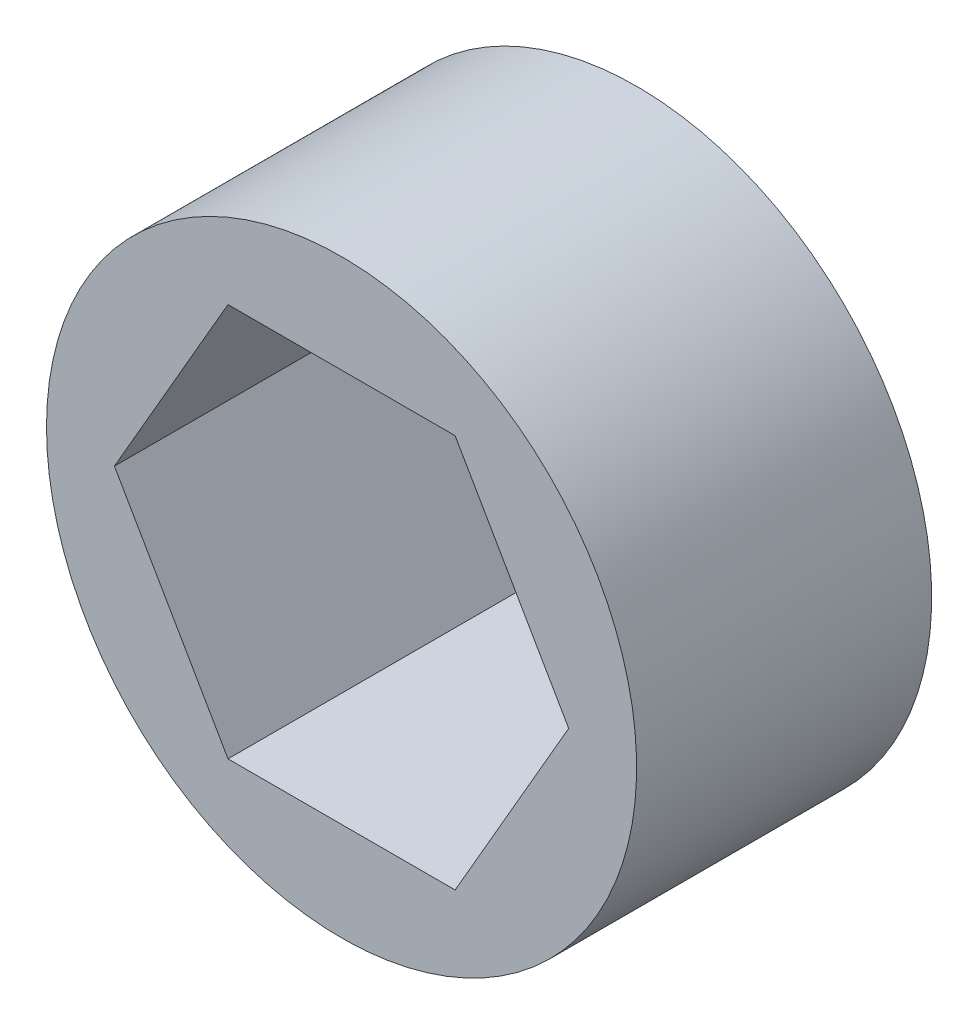
ISO-10303-21;
HEADER;
FILE_DESCRIPTION(('STEP AP214'),'2;1');
FILE_NAME('part.step','',(''),(''),'','','');
FILE_SCHEMA(('AUTOMOTIVE_DESIGN { 1 0 10303 214 1 1 1 1 }'));
ENDSEC;
DATA;
#1=APPLICATION_CONTEXT('core data for automotive mechanical design processes');
#2=APPLICATION_PROTOCOL_DEFINITION('international standard','automotive_design',2000,#1);
#3=PRODUCT_CONTEXT('',#1,'mechanical');
#4=PRODUCT('Part','Part','',(#3));
#5=PRODUCT_RELATED_PRODUCT_CATEGORY('part','',(#4));
#6=PRODUCT_DEFINITION_FORMATION('','',#4);
#7=PRODUCT_DEFINITION_CONTEXT('part definition',#1,'design');
#8=PRODUCT_DEFINITION('design','',#6,#7);
#9=PRODUCT_DEFINITION_SHAPE('','',#8);
#10=(LENGTH_UNIT() NAMED_UNIT(*) SI_UNIT(.MILLI.,.METRE.));
#11=(NAMED_UNIT(*) PLANE_ANGLE_UNIT() SI_UNIT($,.RADIAN.));
#12=(NAMED_UNIT(*) SI_UNIT($,.STERADIAN.) SOLID_ANGLE_UNIT());
#13=UNCERTAINTY_MEASURE_WITH_UNIT(LENGTH_MEASURE(1.E-05),#10,'distance_accuracy_value','');
#14=(GEOMETRIC_REPRESENTATION_CONTEXT(3) GLOBAL_UNCERTAINTY_ASSIGNED_CONTEXT((#13)) GLOBAL_UNIT_ASSIGNED_CONTEXT((#10,
#11,#12)) REPRESENTATION_CONTEXT('',''));
#15=CARTESIAN_POINT('',(0.,0.,0.));
#16=DIRECTION('',(0.,0.,1.));
#17=DIRECTION('',(1.,0.,0.));
#18=AXIS2_PLACEMENT_3D('',#15,#16,#17);
#19=CARTESIAN_POINT('',(0.,0.,9.525));
#20=DIRECTION('',(0.,0.,1.));
#21=DIRECTION('',(1.,0.,0.));
#22=AXIS2_PLACEMENT_3D('',#19,#20,#21);
#23=PLANE('',#22);
#24=CARTESIAN_POINT('',(0.,0.,9.525));
#25=DIRECTION('',(0.,0.,1.));
#26=DIRECTION('',(1.,0.,0.));
#27=AXIS2_PLACEMENT_3D('',#24,#25,#26);
#28=CIRCLE('',#27,9.525);
#29=CARTESIAN_POINT('',(-9.525,0.,9.525));
#30=VERTEX_POINT('',#29);
#31=EDGE_CURVE('E12',#30,#30,#28,.T.);
#32=ORIENTED_EDGE('',*,*,#31,.T.);
#33=EDGE_LOOP('',(#32));
#34=FACE_BOUND('',#33,.T.);
#35=DIRECTION('',(0.5,0.866025403784439,0.));
#36=VECTOR('',#35,1.);
#37=CARTESIAN_POINT('',(5.49926131403119,-3.175,9.525));
#38=LINE('',#37,#36);
#39=CARTESIAN_POINT('',(3.66617420935413,-6.35,9.525));
#40=VERTEX_POINT('',#39);
#41=CARTESIAN_POINT('',(7.33234841870825,0.,9.525));
#42=VERTEX_POINT('',#41);
#43=EDGE_CURVE('E133',#40,#42,#38,.T.);
#44=ORIENTED_EDGE('',*,*,#43,.F.);
#45=DIRECTION('',(1.,0.,0.));
#46=VECTOR('',#45,1.);
#47=CARTESIAN_POINT('',(0.,-6.35,9.525));
#48=LINE('',#47,#46);
#49=CARTESIAN_POINT('',(-3.66617420935412,-6.35,9.525));
#50=VERTEX_POINT('',#49);
#51=EDGE_CURVE('E124',#50,#40,#48,.T.);
#52=ORIENTED_EDGE('',*,*,#51,.F.);
#53=DIRECTION('',(0.5,-0.866025403784439,0.));
#54=VECTOR('',#53,1.);
#55=CARTESIAN_POINT('',(-5.49926131403118,-3.175,9.525));
#56=LINE('',#55,#54);
#57=CARTESIAN_POINT('',(-7.33234841870825,0.,9.525));
#58=VERTEX_POINT('',#57);
#59=EDGE_CURVE('E158',#58,#50,#56,.T.);
#60=ORIENTED_EDGE('',*,*,#59,.F.);
#61=DIRECTION('',(-0.5,-0.866025403784439,0.));
#62=VECTOR('',#61,1.);
#63=CARTESIAN_POINT('',(-5.49926131403118,3.175,9.525));
#64=LINE('',#63,#62);
#65=CARTESIAN_POINT('',(-3.66617420935412,6.35,9.525));
#66=VERTEX_POINT('',#65);
#67=EDGE_CURVE('E155',#66,#58,#64,.T.);
#68=ORIENTED_EDGE('',*,*,#67,.F.);
#69=DIRECTION('',(-1.,0.,0.));
#70=VECTOR('',#69,1.);
#71=CARTESIAN_POINT('',(0.,6.35,9.525));
#72=LINE('',#71,#70);
#73=CARTESIAN_POINT('',(3.66617420935412,6.35,9.525));
#74=VERTEX_POINT('',#73);
#75=EDGE_CURVE('E150',#74,#66,#72,.T.);
#76=ORIENTED_EDGE('',*,*,#75,.F.);
#77=DIRECTION('',(-0.5,0.866025403784439,0.));
#78=VECTOR('',#77,1.);
#79=CARTESIAN_POINT('',(5.49926131403118,3.175,9.525));
#80=LINE('',#79,#78);
#81=EDGE_CURVE('E146',#42,#74,#80,.T.);
#82=ORIENTED_EDGE('',*,*,#81,.F.);
#83=EDGE_LOOP('',(#44,#52,#60,#68,#76,#82));
#84=FACE_BOUND('',#83,.T.);
#85=ADVANCED_FACE('F70',(#34,#84),#23,.T.);
#86=CARTESIAN_POINT('',(0.,0.,0.));
#87=DIRECTION('',(0.,0.,1.));
#88=DIRECTION('',(1.,0.,0.));
#89=AXIS2_PLACEMENT_3D('',#86,#87,#88);
#90=PLANE('',#89);
#91=CARTESIAN_POINT('',(0.,0.,0.));
#92=DIRECTION('',(0.,0.,1.));
#93=DIRECTION('',(1.,0.,0.));
#94=AXIS2_PLACEMENT_3D('',#91,#92,#93);
#95=CIRCLE('',#94,9.525);
#96=CARTESIAN_POINT('',(-9.525,0.,0.));
#97=VERTEX_POINT('',#96);
#98=EDGE_CURVE('E74',#97,#97,#95,.T.);
#99=ORIENTED_EDGE('',*,*,#98,.F.);
#100=EDGE_LOOP('',(#99));
#101=FACE_BOUND('',#100,.T.);
#102=DIRECTION('',(1.,0.,0.));
#103=VECTOR('',#102,1.);
#104=CARTESIAN_POINT('',(0.,-6.35,0.));
#105=LINE('',#104,#103);
#106=CARTESIAN_POINT('',(-3.66617420935412,-6.35,0.));
#107=VERTEX_POINT('',#106);
#108=CARTESIAN_POINT('',(3.66617420935413,-6.35,0.));
#109=VERTEX_POINT('',#108);
#110=EDGE_CURVE('E94',#107,#109,#105,.T.);
#111=ORIENTED_EDGE('',*,*,#110,.T.);
#112=DIRECTION('',(0.5,0.866025403784439,0.));
#113=VECTOR('',#112,1.);
#114=CARTESIAN_POINT('',(5.49926131403119,-3.175,0.));
#115=LINE('',#114,#113);
#116=CARTESIAN_POINT('',(7.33234841870825,0.,0.));
#117=VERTEX_POINT('',#116);
#118=EDGE_CURVE('E140',#109,#117,#115,.T.);
#119=ORIENTED_EDGE('',*,*,#118,.T.);
#120=DIRECTION('',(-0.5,0.866025403784439,0.));
#121=VECTOR('',#120,1.);
#122=CARTESIAN_POINT('',(5.49926131403118,3.175,0.));
#123=LINE('',#122,#121);
#124=CARTESIAN_POINT('',(3.66617420935412,6.35,0.));
#125=VERTEX_POINT('',#124);
#126=EDGE_CURVE('E165',#117,#125,#123,.T.);
#127=ORIENTED_EDGE('',*,*,#126,.T.);
#128=DIRECTION('',(-1.,0.,0.));
#129=VECTOR('',#128,1.);
#130=CARTESIAN_POINT('',(0.,6.35,0.));
#131=LINE('',#130,#129);
#132=CARTESIAN_POINT('',(-3.66617420935412,6.35,0.));
#133=VERTEX_POINT('',#132);
#134=EDGE_CURVE('E169',#125,#133,#131,.T.);
#135=ORIENTED_EDGE('',*,*,#134,.T.);
#136=DIRECTION('',(-0.5,-0.866025403784439,0.));
#137=VECTOR('',#136,1.);
#138=CARTESIAN_POINT('',(-5.49926131403118,3.175,0.));
#139=LINE('',#138,#137);
#140=CARTESIAN_POINT('',(-7.33234841870825,0.,0.));
#141=VERTEX_POINT('',#140);
#142=EDGE_CURVE('E173',#133,#141,#139,.T.);
#143=ORIENTED_EDGE('',*,*,#142,.T.);
#144=DIRECTION('',(0.5,-0.866025403784439,0.));
#145=VECTOR('',#144,1.);
#146=CARTESIAN_POINT('',(-5.49926131403118,-3.175,0.));
#147=LINE('',#146,#145);
#148=EDGE_CURVE('E134',#141,#107,#147,.T.);
#149=ORIENTED_EDGE('',*,*,#148,.T.);
#150=EDGE_LOOP('',(#111,#119,#127,#135,#143,#149));
#151=FACE_BOUND('',#150,.T.);
#152=ADVANCED_FACE('F197',(#101,#151),#90,.F.);
#153=CARTESIAN_POINT('',(0.,0.,9.525));
#154=DIRECTION('',(0.,0.,-1.));
#155=DIRECTION('',(-1.,0.,0.));
#156=AXIS2_PLACEMENT_3D('',#153,#154,#155);
#157=CYLINDRICAL_SURFACE('',#156,9.525);
#158=CARTESIAN_POINT('',(-9.525,0.,9.525));
#159=CARTESIAN_POINT('',(-9.525,0.,9.42578125));
#160=CARTESIAN_POINT('',(-9.525,0.,9.3265625));
#161=CARTESIAN_POINT('',(-9.525,0.,9.128125));
#162=CARTESIAN_POINT('',(-9.525,0.,9.02890625));
#163=CARTESIAN_POINT('',(-9.525,0.,8.83046875));
#164=CARTESIAN_POINT('',(-9.525,0.,8.73125));
#165=CARTESIAN_POINT('',(-9.525,0.,8.5328125));
#166=CARTESIAN_POINT('',(-9.525,0.,8.43359375));
#167=CARTESIAN_POINT('',(-9.525,0.,8.23515625));
#168=CARTESIAN_POINT('',(-9.525,0.,8.1359375));
#169=CARTESIAN_POINT('',(-9.525,0.,7.9375));
#170=CARTESIAN_POINT('',(-9.525,0.,7.83828125));
#171=CARTESIAN_POINT('',(-9.525,0.,7.63984375));
#172=CARTESIAN_POINT('',(-9.525,0.,7.540625));
#173=CARTESIAN_POINT('',(-9.525,0.,7.3421875));
#174=CARTESIAN_POINT('',(-9.525,0.,7.24296875));
#175=CARTESIAN_POINT('',(-9.525,0.,7.04453125));
#176=CARTESIAN_POINT('',(-9.525,0.,6.9453125));
#177=CARTESIAN_POINT('',(-9.525,0.,6.746875));
#178=CARTESIAN_POINT('',(-9.525,0.,6.64765625));
#179=CARTESIAN_POINT('',(-9.525,0.,6.44921875));
#180=CARTESIAN_POINT('',(-9.525,0.,6.35));
#181=CARTESIAN_POINT('',(-9.525,0.,6.1515625));
#182=CARTESIAN_POINT('',(-9.525,0.,6.05234375));
#183=CARTESIAN_POINT('',(-9.525,0.,5.85390625));
#184=CARTESIAN_POINT('',(-9.525,0.,5.7546875));
#185=CARTESIAN_POINT('',(-9.525,0.,5.55625));
#186=CARTESIAN_POINT('',(-9.525,0.,5.45703125));
#187=CARTESIAN_POINT('',(-9.525,0.,5.25859375));
#188=CARTESIAN_POINT('',(-9.525,0.,5.159375));
#189=CARTESIAN_POINT('',(-9.525,0.,4.9609375));
#190=CARTESIAN_POINT('',(-9.525,0.,4.86171875));
#191=CARTESIAN_POINT('',(-9.525,0.,4.66328125));
#192=CARTESIAN_POINT('',(-9.525,0.,4.5640625));
#193=CARTESIAN_POINT('',(-9.525,0.,4.365625));
#194=CARTESIAN_POINT('',(-9.525,0.,4.26640625));
#195=CARTESIAN_POINT('',(-9.525,0.,4.06796875));
#196=CARTESIAN_POINT('',(-9.525,0.,3.96875));
#197=CARTESIAN_POINT('',(-9.525,0.,3.7703125));
#198=CARTESIAN_POINT('',(-9.525,0.,3.67109375));
#199=CARTESIAN_POINT('',(-9.525,0.,3.47265625));
#200=CARTESIAN_POINT('',(-9.525,0.,3.3734375));
#201=CARTESIAN_POINT('',(-9.525,0.,3.175));
#202=CARTESIAN_POINT('',(-9.525,0.,3.07578125));
#203=CARTESIAN_POINT('',(-9.525,0.,2.87734375));
#204=CARTESIAN_POINT('',(-9.525,0.,2.778125));
#205=CARTESIAN_POINT('',(-9.525,0.,2.5796875));
#206=CARTESIAN_POINT('',(-9.525,0.,2.48046875));
#207=CARTESIAN_POINT('',(-9.525,0.,2.28203125));
#208=CARTESIAN_POINT('',(-9.525,0.,2.1828125));
#209=CARTESIAN_POINT('',(-9.525,0.,1.984375));
#210=CARTESIAN_POINT('',(-9.525,0.,1.88515625));
#211=CARTESIAN_POINT('',(-9.525,0.,1.68671875));
#212=CARTESIAN_POINT('',(-9.525,0.,1.5875));
#213=CARTESIAN_POINT('',(-9.525,0.,1.3890625));
#214=CARTESIAN_POINT('',(-9.525,0.,1.28984375));
#215=CARTESIAN_POINT('',(-9.525,0.,1.09140625));
#216=CARTESIAN_POINT('',(-9.525,0.,0.992187500000001));
#217=CARTESIAN_POINT('',(-9.525,0.,0.793750000000001));
#218=CARTESIAN_POINT('',(-9.525,0.,0.69453125));
#219=CARTESIAN_POINT('',(-9.525,0.,0.49609375));
#220=CARTESIAN_POINT('',(-9.525,0.,0.396875));
#221=CARTESIAN_POINT('',(-9.525,0.,0.1984375));
#222=CARTESIAN_POINT('',(-9.525,0.,0.0992187500000001));
#223=CARTESIAN_POINT('',(-9.525,0.,0.));
#224=B_SPLINE_CURVE_WITH_KNOTS('',3,(#158,#159,#160,#161,#162,#163,#164,#165,#166,#167,#168,
#169,#170,#171,#172,#173,#174,#175,#176,#177,#178,#179,#180,#181,#182,#183,#184,#185,#186,#187,
#188,#189,#190,#191,#192,#193,#194,#195,#196,#197,#198,#199,#200,#201,#202,#203,#204,#205,#206,
#207,#208,#209,#210,#211,#212,#213,#214,#215,#216,#217,#218,#219,#220,#221,#222,#223),
.UNSPECIFIED.,.F.,.F.,(4,2,2,2,2,2,2,2,2,2,2,2,2,2,2,2,2,2,2,2,2,2,2,2,2,2,2,2,2,2,2,2,4),(0.,
0.29765625,0.5953125,0.892968750000001,1.190625,1.48828125,1.7859375,2.08359375,2.38125,
2.67890625,2.9765625,3.27421875,3.571875,3.86953125,4.1671875,4.46484375,4.7625,5.06015625,
5.3578125,5.65546875,5.953125,6.25078125,6.5484375,6.84609375,7.14375,7.44140625,7.7390625,
8.03671875,8.334375,8.63203125,8.9296875,9.22734375,9.525),.UNSPECIFIED.);
#225=EDGE_CURVE('BSEAM72',#30,#97,#224,.T.);
#226=ORIENTED_EDGE('',*,*,#31,.F.);
#227=ORIENTED_EDGE('',*,*,#98,.T.);
#228=ORIENTED_EDGE('',*,*,#225,.T.);
#229=ORIENTED_EDGE('',*,*,#225,.F.);
#230=EDGE_LOOP('',(#226,#228,#227,#229));
#231=FACE_BOUND('',#230,.T.);
#232=ADVANCED_FACE('F72',(#231),#157,.T.);
#233=CARTESIAN_POINT('',(0.,-6.35,9.525));
#234=DIRECTION('',(0.,1.,0.));
#235=DIRECTION('',(0.,0.,1.));
#236=AXIS2_PLACEMENT_3D('',#233,#234,#235);
#237=PLANE('',#236);
#238=ORIENTED_EDGE('',*,*,#110,.F.);
#239=DIRECTION('',(0.,0.,-1.));
#240=VECTOR('',#239,1.);
#241=CARTESIAN_POINT('',(-3.66617420935412,-6.35,9.525));
#242=LINE('',#241,#240);
#243=EDGE_CURVE('E128',#50,#107,#242,.T.);
#244=ORIENTED_EDGE('',*,*,#243,.F.);
#245=ORIENTED_EDGE('',*,*,#51,.T.);
#246=DIRECTION('',(0.,0.,-1.));
#247=VECTOR('',#246,1.);
#248=CARTESIAN_POINT('',(3.66617420935413,-6.35,9.525));
#249=LINE('',#248,#247);
#250=EDGE_CURVE('E127',#40,#109,#249,.T.);
#251=ORIENTED_EDGE('',*,*,#250,.T.);
#252=EDGE_LOOP('',(#238,#244,#245,#251));
#253=FACE_BOUND('',#252,.T.);
#254=ADVANCED_FACE('F126',(#253),#237,.T.);
#255=CARTESIAN_POINT('',(5.49926131403119,-3.175,9.525));
#256=DIRECTION('',(-0.866025403784439,0.5,0.));
#257=DIRECTION('',(-0.5,-0.866025403784439,0.));
#258=AXIS2_PLACEMENT_3D('',#255,#256,#257);
#259=PLANE('',#258);
#260=ORIENTED_EDGE('',*,*,#118,.F.);
#261=ORIENTED_EDGE('',*,*,#250,.F.);
#262=ORIENTED_EDGE('',*,*,#43,.T.);
#263=DIRECTION('',(0.,0.,-1.));
#264=VECTOR('',#263,1.);
#265=CARTESIAN_POINT('',(7.33234841870825,0.,9.525));
#266=LINE('',#265,#264);
#267=EDGE_CURVE('E142',#42,#117,#266,.T.);
#268=ORIENTED_EDGE('',*,*,#267,.T.);
#269=EDGE_LOOP('',(#260,#261,#262,#268));
#270=FACE_BOUND('',#269,.T.);
#271=ADVANCED_FACE('F137',(#270),#259,.T.);
#272=CARTESIAN_POINT('',(5.49926131403118,3.175,9.525));
#273=DIRECTION('',(-0.866025403784439,-0.5,0.));
#274=DIRECTION('',(0.5,-0.866025403784438,0.));
#275=AXIS2_PLACEMENT_3D('',#272,#273,#274);
#276=PLANE('',#275);
#277=ORIENTED_EDGE('',*,*,#126,.F.);
#278=ORIENTED_EDGE('',*,*,#267,.F.);
#279=ORIENTED_EDGE('',*,*,#81,.T.);
#280=DIRECTION('',(0.,0.,-1.));
#281=VECTOR('',#280,1.);
#282=CARTESIAN_POINT('',(3.66617420935412,6.35,9.525));
#283=LINE('',#282,#281);
#284=EDGE_CURVE('E187',#74,#125,#283,.T.);
#285=ORIENTED_EDGE('',*,*,#284,.T.);
#286=EDGE_LOOP('',(#277,#278,#279,#285));
#287=FACE_BOUND('',#286,.T.);
#288=ADVANCED_FACE('F193',(#287),#276,.T.);
#289=CARTESIAN_POINT('',(0.,6.35,9.525));
#290=DIRECTION('',(0.,-1.,0.));
#291=DIRECTION('',(1.,0.,0.));
#292=AXIS2_PLACEMENT_3D('',#289,#290,#291);
#293=PLANE('',#292);
#294=ORIENTED_EDGE('',*,*,#134,.F.);
#295=ORIENTED_EDGE('',*,*,#284,.F.);
#296=ORIENTED_EDGE('',*,*,#75,.T.);
#297=DIRECTION('',(0.,0.,-1.));
#298=VECTOR('',#297,1.);
#299=CARTESIAN_POINT('',(-3.66617420935412,6.35,9.525));
#300=LINE('',#299,#298);
#301=EDGE_CURVE('E184',#66,#133,#300,.T.);
#302=ORIENTED_EDGE('',*,*,#301,.T.);
#303=EDGE_LOOP('',(#294,#295,#296,#302));
#304=FACE_BOUND('',#303,.T.);
#305=ADVANCED_FACE('F205',(#304),#293,.T.);
#306=CARTESIAN_POINT('',(-5.49926131403118,3.175,9.525));
#307=DIRECTION('',(0.866025403784439,-0.5,0.));
#308=DIRECTION('',(0.5,0.866025403784439,0.));
#309=AXIS2_PLACEMENT_3D('',#306,#307,#308);
#310=PLANE('',#309);
#311=ORIENTED_EDGE('',*,*,#142,.F.);
#312=ORIENTED_EDGE('',*,*,#301,.F.);
#313=ORIENTED_EDGE('',*,*,#67,.T.);
#314=DIRECTION('',(0.,0.,-1.));
#315=VECTOR('',#314,1.);
#316=CARTESIAN_POINT('',(-7.33234841870825,0.,9.525));
#317=LINE('',#316,#315);
#318=EDGE_CURVE('E86',#58,#141,#317,.T.);
#319=ORIENTED_EDGE('',*,*,#318,.T.);
#320=EDGE_LOOP('',(#311,#312,#313,#319));
#321=FACE_BOUND('',#320,.T.);
#322=ADVANCED_FACE('F203',(#321),#310,.T.);
#323=CARTESIAN_POINT('',(-5.49926131403118,-3.175,9.525));
#324=DIRECTION('',(0.866025403784439,0.5,0.));
#325=DIRECTION('',(-0.5,0.866025403784438,0.));
#326=AXIS2_PLACEMENT_3D('',#323,#324,#325);
#327=PLANE('',#326);
#328=ORIENTED_EDGE('',*,*,#148,.F.);
#329=ORIENTED_EDGE('',*,*,#318,.F.);
#330=ORIENTED_EDGE('',*,*,#59,.T.);
#331=ORIENTED_EDGE('',*,*,#243,.T.);
#332=EDGE_LOOP('',(#328,#329,#330,#331));
#333=FACE_BOUND('',#332,.T.);
#334=ADVANCED_FACE('F199',(#333),#327,.T.);
#335=CLOSED_SHELL('',(#85,#152,#232,#254,#271,#288,#305,#322,#334));
#336=MANIFOLD_SOLID_BREP('B2',#335);
#337=ADVANCED_BREP_SHAPE_REPRESENTATION('',(#18,#336),#14);
#338=SHAPE_DEFINITION_REPRESENTATION(#9,#337);
ENDSEC;
END-ISO-10303-21;
